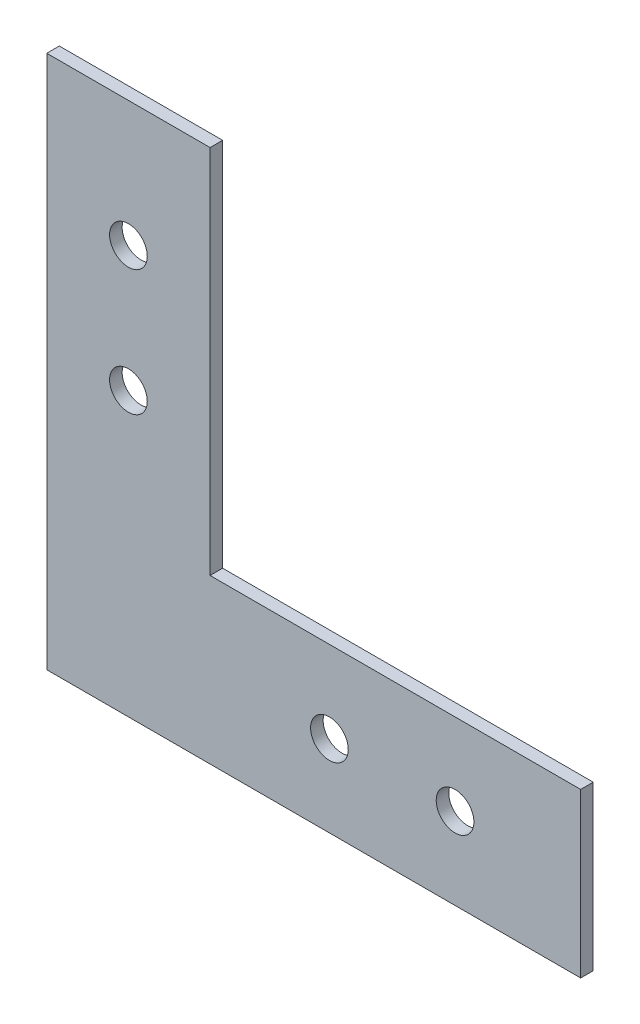
ISO-10303-21;
HEADER;
FILE_DESCRIPTION(('STEP AP214'),'2;1');
FILE_NAME('part.step','',(''),(''),'','','');
FILE_SCHEMA(('AUTOMOTIVE_DESIGN { 1 0 10303 214 1 1 1 1 }'));
ENDSEC;
DATA;
#1=APPLICATION_CONTEXT('core data for automotive mechanical design processes');
#2=APPLICATION_PROTOCOL_DEFINITION('international standard','automotive_design',2000,#1);
#3=PRODUCT_CONTEXT('',#1,'mechanical');
#4=PRODUCT('Part','Part','',(#3));
#5=PRODUCT_RELATED_PRODUCT_CATEGORY('part','',(#4));
#6=PRODUCT_DEFINITION_FORMATION('','',#4);
#7=PRODUCT_DEFINITION_CONTEXT('part definition',#1,'design');
#8=PRODUCT_DEFINITION('design','',#6,#7);
#9=PRODUCT_DEFINITION_SHAPE('','',#8);
#10=(LENGTH_UNIT() NAMED_UNIT(*) SI_UNIT(.MILLI.,.METRE.));
#11=(NAMED_UNIT(*) PLANE_ANGLE_UNIT() SI_UNIT($,.RADIAN.));
#12=(NAMED_UNIT(*) SI_UNIT($,.STERADIAN.) SOLID_ANGLE_UNIT());
#13=UNCERTAINTY_MEASURE_WITH_UNIT(LENGTH_MEASURE(1.E-05),#10,'distance_accuracy_value','');
#14=(GEOMETRIC_REPRESENTATION_CONTEXT(3) GLOBAL_UNCERTAINTY_ASSIGNED_CONTEXT((#13)) GLOBAL_UNIT_ASSIGNED_CONTEXT((#10,
#11,#12)) REPRESENTATION_CONTEXT('',''));
#15=CARTESIAN_POINT('',(0.,0.,0.));
#16=DIRECTION('',(0.,0.,1.));
#17=DIRECTION('',(1.,0.,0.));
#18=AXIS2_PLACEMENT_3D('',#15,#16,#17);
#19=CARTESIAN_POINT('',(13.,42.5,2.));
#20=DIRECTION('',(0.,0.,-1.));
#21=DIRECTION('',(-1.,0.,0.));
#22=AXIS2_PLACEMENT_3D('',#19,#20,#21);
#23=PLANE('',#22);
#24=CARTESIAN_POINT('',(52.,-29.4999999999999,2.));
#25=DIRECTION('',(0.,0.,-1.));
#26=DIRECTION('',(0.,1.,0.));
#27=AXIS2_PLACEMENT_3D('',#24,#25,#26);
#28=CIRCLE('',#27,3.);
#29=CARTESIAN_POINT('',(52.,-26.4999999999999,2.));
#30=VERTEX_POINT('',#29);
#31=EDGE_CURVE('E149',#30,#30,#28,.T.);
#32=ORIENTED_EDGE('',*,*,#31,.T.);
#33=EDGE_LOOP('',(#32));
#34=FACE_BOUND('',#33,.T.);
#35=CARTESIAN_POINT('',(0.,2.49999999999998,2.));
#36=DIRECTION('',(0.,0.,1.));
#37=DIRECTION('',(1.,0.,0.));
#38=AXIS2_PLACEMENT_3D('',#35,#36,#37);
#39=CIRCLE('',#38,3.);
#40=CARTESIAN_POINT('',(3.,2.49999999999998,2.));
#41=VERTEX_POINT('',#40);
#42=EDGE_CURVE('E146',#41,#41,#39,.T.);
#43=ORIENTED_EDGE('',*,*,#42,.F.);
#44=EDGE_LOOP('',(#43));
#45=FACE_BOUND('',#44,.T.);
#46=CARTESIAN_POINT('',(0.,22.5,2.));
#47=DIRECTION('',(0.,0.,1.));
#48=DIRECTION('',(1.,0.,0.));
#49=AXIS2_PLACEMENT_3D('',#46,#47,#48);
#50=CIRCLE('',#49,3.);
#51=CARTESIAN_POINT('',(3.,22.5,2.));
#52=VERTEX_POINT('',#51);
#53=EDGE_CURVE('E143',#52,#52,#50,.T.);
#54=ORIENTED_EDGE('',*,*,#53,.F.);
#55=EDGE_LOOP('',(#54));
#56=FACE_BOUND('',#55,.T.);
#57=DIRECTION('',(0.,-1.,0.));
#58=VECTOR('',#57,1.);
#59=CARTESIAN_POINT('',(-13.,-42.5,2.));
#60=LINE('',#59,#58);
#61=CARTESIAN_POINT('',(-13.,42.5,2.));
#62=VERTEX_POINT('',#61);
#63=CARTESIAN_POINT('',(-13.,-42.5,2.));
#64=VERTEX_POINT('',#63);
#65=EDGE_CURVE('E59',#62,#64,#60,.T.);
#66=ORIENTED_EDGE('',*,*,#65,.T.);
#67=DIRECTION('',(1.,0.,0.));
#68=VECTOR('',#67,1.);
#69=CARTESIAN_POINT('',(-13.,-42.5,2.));
#70=LINE('',#69,#68);
#71=CARTESIAN_POINT('',(72.,-42.4999999999997,2.));
#72=VERTEX_POINT('',#71);
#73=EDGE_CURVE('E95',#64,#72,#70,.T.);
#74=ORIENTED_EDGE('',*,*,#73,.T.);
#75=DIRECTION('',(0.,-1.,0.));
#76=VECTOR('',#75,1.);
#77=CARTESIAN_POINT('',(72.,-42.4999999999997,2.));
#78=LINE('',#77,#76);
#79=CARTESIAN_POINT('',(71.9999999999999,-16.4999999999998,2.));
#80=VERTEX_POINT('',#79);
#81=EDGE_CURVE('E99',#80,#72,#78,.T.);
#82=ORIENTED_EDGE('',*,*,#81,.F.);
#83=DIRECTION('',(1.,0.,0.));
#84=VECTOR('',#83,1.);
#85=CARTESIAN_POINT('',(-13.0000000000001,-16.5,2.));
#86=LINE('',#85,#84);
#87=CARTESIAN_POINT('',(13.,-16.5,2.));
#88=VERTEX_POINT('',#87);
#89=EDGE_CURVE('E117',#88,#80,#86,.T.);
#90=ORIENTED_EDGE('',*,*,#89,.F.);
#91=DIRECTION('',(0.,1.,0.));
#92=VECTOR('',#91,1.);
#93=CARTESIAN_POINT('',(13.,-42.5,2.));
#94=LINE('',#93,#92);
#95=CARTESIAN_POINT('',(13.,42.5,2.));
#96=VERTEX_POINT('',#95);
#97=EDGE_CURVE('E50',#88,#96,#94,.T.);
#98=ORIENTED_EDGE('',*,*,#97,.T.);
#99=DIRECTION('',(-1.,0.,0.));
#100=VECTOR('',#99,1.);
#101=CARTESIAN_POINT('',(-13.,42.5,2.));
#102=LINE('',#101,#100);
#103=EDGE_CURVE('E131',#96,#62,#102,.T.);
#104=ORIENTED_EDGE('',*,*,#103,.T.);
#105=EDGE_LOOP('',(#66,#74,#82,#90,#98,#104));
#106=FACE_BOUND('',#105,.T.);
#107=CARTESIAN_POINT('',(32.,-29.5,2.));
#108=DIRECTION('',(0.,0.,-1.));
#109=DIRECTION('',(0.,1.,0.));
#110=AXIS2_PLACEMENT_3D('',#107,#108,#109);
#111=CIRCLE('',#110,3.);
#112=CARTESIAN_POINT('',(32.,-26.5,2.));
#113=VERTEX_POINT('',#112);
#114=EDGE_CURVE('E159',#113,#113,#111,.T.);
#115=ORIENTED_EDGE('',*,*,#114,.T.);
#116=EDGE_LOOP('',(#115));
#117=FACE_BOUND('',#116,.T.);
#118=ADVANCED_FACE('F33',(#34,#45,#56,#106,#117),#23,.F.);
#119=CARTESIAN_POINT('',(13.,42.5,0.));
#120=DIRECTION('',(0.,0.,-1.));
#121=DIRECTION('',(-1.,0.,0.));
#122=AXIS2_PLACEMENT_3D('',#119,#120,#121);
#123=PLANE('',#122);
#124=CARTESIAN_POINT('',(52.,-29.4999999999999,0.));
#125=DIRECTION('',(0.,0.,-1.));
#126=DIRECTION('',(-1.,0.,0.));
#127=AXIS2_PLACEMENT_3D('',#124,#125,#126);
#128=CIRCLE('',#127,3.);
#129=CARTESIAN_POINT('',(49.,-29.4999999999999,0.));
#130=VERTEX_POINT('',#129);
#131=EDGE_CURVE('E147',#130,#130,#128,.F.);
#132=ORIENTED_EDGE('',*,*,#131,.T.);
#133=EDGE_LOOP('',(#132));
#134=FACE_BOUND('',#133,.T.);
#135=CARTESIAN_POINT('',(0.,2.49999999999998,0.));
#136=DIRECTION('',(0.,0.,-1.));
#137=DIRECTION('',(-1.,0.,0.));
#138=AXIS2_PLACEMENT_3D('',#135,#136,#137);
#139=CIRCLE('',#138,3.);
#140=CARTESIAN_POINT('',(-3.,2.49999999999998,0.));
#141=VERTEX_POINT('',#140);
#142=EDGE_CURVE('E144',#141,#141,#139,.T.);
#143=ORIENTED_EDGE('',*,*,#142,.F.);
#144=EDGE_LOOP('',(#143));
#145=FACE_BOUND('',#144,.T.);
#146=CARTESIAN_POINT('',(0.,22.5,0.));
#147=DIRECTION('',(0.,0.,-1.));
#148=DIRECTION('',(-1.,0.,0.));
#149=AXIS2_PLACEMENT_3D('',#146,#147,#148);
#150=CIRCLE('',#149,3.);
#151=CARTESIAN_POINT('',(-3.,22.5,0.));
#152=VERTEX_POINT('',#151);
#153=EDGE_CURVE('E126',#152,#152,#150,.T.);
#154=ORIENTED_EDGE('',*,*,#153,.F.);
#155=EDGE_LOOP('',(#154));
#156=FACE_BOUND('',#155,.T.);
#157=DIRECTION('',(0.,1.,0.));
#158=VECTOR('',#157,1.);
#159=CARTESIAN_POINT('',(13.,-42.5,0.));
#160=LINE('',#159,#158);
#161=CARTESIAN_POINT('',(13.,-16.5,0.));
#162=VERTEX_POINT('',#161);
#163=CARTESIAN_POINT('',(13.,42.5,0.));
#164=VERTEX_POINT('',#163);
#165=EDGE_CURVE('E129',#162,#164,#160,.T.);
#166=ORIENTED_EDGE('',*,*,#165,.F.);
#167=DIRECTION('',(1.,0.,0.));
#168=VECTOR('',#167,1.);
#169=CARTESIAN_POINT('',(-13.0000000000001,-16.5,0.));
#170=LINE('',#169,#168);
#171=CARTESIAN_POINT('',(71.9999999999999,-16.4999999999998,0.));
#172=VERTEX_POINT('',#171);
#173=EDGE_CURVE('E124',#162,#172,#170,.T.);
#174=ORIENTED_EDGE('',*,*,#173,.T.);
#175=DIRECTION('',(0.,-1.,0.));
#176=VECTOR('',#175,1.);
#177=CARTESIAN_POINT('',(72.,-42.4999999999997,0.));
#178=LINE('',#177,#176);
#179=CARTESIAN_POINT('',(72.,-42.4999999999997,0.));
#180=VERTEX_POINT('',#179);
#181=EDGE_CURVE('E120',#172,#180,#178,.T.);
#182=ORIENTED_EDGE('',*,*,#181,.T.);
#183=DIRECTION('',(1.,0.,0.));
#184=VECTOR('',#183,1.);
#185=CARTESIAN_POINT('',(-13.,-42.5,0.));
#186=LINE('',#185,#184);
#187=CARTESIAN_POINT('',(-13.,-42.5,0.));
#188=VERTEX_POINT('',#187);
#189=EDGE_CURVE('E107',#188,#180,#186,.T.);
#190=ORIENTED_EDGE('',*,*,#189,.F.);
#191=DIRECTION('',(0.,-1.,0.));
#192=VECTOR('',#191,1.);
#193=CARTESIAN_POINT('',(-13.,-42.5,0.));
#194=LINE('',#193,#192);
#195=CARTESIAN_POINT('',(-13.,42.5,0.));
#196=VERTEX_POINT('',#195);
#197=EDGE_CURVE('E76',#196,#188,#194,.T.);
#198=ORIENTED_EDGE('',*,*,#197,.F.);
#199=DIRECTION('',(-1.,0.,0.));
#200=VECTOR('',#199,1.);
#201=CARTESIAN_POINT('',(-13.,42.5,0.));
#202=LINE('',#201,#200);
#203=EDGE_CURVE('E135',#164,#196,#202,.T.);
#204=ORIENTED_EDGE('',*,*,#203,.F.);
#205=EDGE_LOOP('',(#166,#174,#182,#190,#198,#204));
#206=FACE_BOUND('',#205,.T.);
#207=CARTESIAN_POINT('',(32.,-29.5,0.));
#208=DIRECTION('',(0.,0.,-1.));
#209=DIRECTION('',(-1.,0.,0.));
#210=AXIS2_PLACEMENT_3D('',#207,#208,#209);
#211=CIRCLE('',#210,3.);
#212=CARTESIAN_POINT('',(29.,-29.5,0.));
#213=VERTEX_POINT('',#212);
#214=EDGE_CURVE('E37',#213,#213,#211,.F.);
#215=ORIENTED_EDGE('',*,*,#214,.T.);
#216=EDGE_LOOP('',(#215));
#217=FACE_BOUND('',#216,.T.);
#218=ADVANCED_FACE('F167',(#134,#145,#156,#206,#217),#123,.T.);
#219=CARTESIAN_POINT('',(13.,-42.5,2.));
#220=DIRECTION('',(-1.,0.,0.));
#221=DIRECTION('',(0.,0.,1.));
#222=AXIS2_PLACEMENT_3D('',#219,#220,#221);
#223=PLANE('',#222);
#224=ORIENTED_EDGE('',*,*,#97,.F.);
#225=DIRECTION('',(0.,0.,-1.));
#226=VECTOR('',#225,1.);
#227=CARTESIAN_POINT('',(13.,-16.5,2.));
#228=LINE('',#227,#226);
#229=EDGE_CURVE('E111',#88,#162,#228,.T.);
#230=ORIENTED_EDGE('',*,*,#229,.T.);
#231=ORIENTED_EDGE('',*,*,#165,.T.);
#232=DIRECTION('',(0.,0.,-1.));
#233=VECTOR('',#232,1.);
#234=CARTESIAN_POINT('',(13.,42.5,2.));
#235=LINE('',#234,#233);
#236=EDGE_CURVE('E11',#96,#164,#235,.T.);
#237=ORIENTED_EDGE('',*,*,#236,.F.);
#238=EDGE_LOOP('',(#224,#230,#231,#237));
#239=FACE_BOUND('',#238,.T.);
#240=ADVANCED_FACE('F35',(#239),#223,.F.);
#241=CARTESIAN_POINT('',(-13.,42.5,2.));
#242=DIRECTION('',(0.,-1.,0.));
#243=DIRECTION('',(0.,0.,-1.));
#244=AXIS2_PLACEMENT_3D('',#241,#242,#243);
#245=PLANE('',#244);
#246=ORIENTED_EDGE('',*,*,#203,.T.);
#247=DIRECTION('',(0.,0.,-1.));
#248=VECTOR('',#247,1.);
#249=CARTESIAN_POINT('',(-13.,42.5,2.));
#250=LINE('',#249,#248);
#251=EDGE_CURVE('E42',#62,#196,#250,.T.);
#252=ORIENTED_EDGE('',*,*,#251,.F.);
#253=ORIENTED_EDGE('',*,*,#103,.F.);
#254=ORIENTED_EDGE('',*,*,#236,.T.);
#255=EDGE_LOOP('',(#246,#252,#253,#254));
#256=FACE_BOUND('',#255,.T.);
#257=ADVANCED_FACE('F182',(#256),#245,.F.);
#258=CARTESIAN_POINT('',(-13.,-42.5,2.));
#259=DIRECTION('',(1.,0.,0.));
#260=DIRECTION('',(0.,0.,-1.));
#261=AXIS2_PLACEMENT_3D('',#258,#259,#260);
#262=PLANE('',#261);
#263=ORIENTED_EDGE('',*,*,#197,.T.);
#264=DIRECTION('',(0.,0.,-1.));
#265=VECTOR('',#264,1.);
#266=CARTESIAN_POINT('',(-13.,-42.5,2.));
#267=LINE('',#266,#265);
#268=EDGE_CURVE('E101',#64,#188,#267,.T.);
#269=ORIENTED_EDGE('',*,*,#268,.F.);
#270=ORIENTED_EDGE('',*,*,#65,.F.);
#271=ORIENTED_EDGE('',*,*,#251,.T.);
#272=EDGE_LOOP('',(#263,#269,#270,#271));
#273=FACE_BOUND('',#272,.T.);
#274=ADVANCED_FACE('F180',(#273),#262,.F.);
#275=CARTESIAN_POINT('',(-13.,-42.5,2.));
#276=DIRECTION('',(0.,1.,0.));
#277=DIRECTION('',(0.,0.,1.));
#278=AXIS2_PLACEMENT_3D('',#275,#276,#277);
#279=PLANE('',#278);
#280=ORIENTED_EDGE('',*,*,#189,.T.);
#281=DIRECTION('',(0.,0.,-1.));
#282=VECTOR('',#281,1.);
#283=CARTESIAN_POINT('',(72.,-42.4999999999997,2.));
#284=LINE('',#283,#282);
#285=EDGE_CURVE('E104',#72,#180,#284,.T.);
#286=ORIENTED_EDGE('',*,*,#285,.F.);
#287=ORIENTED_EDGE('',*,*,#73,.F.);
#288=ORIENTED_EDGE('',*,*,#268,.T.);
#289=EDGE_LOOP('',(#280,#286,#287,#288));
#290=FACE_BOUND('',#289,.T.);
#291=ADVANCED_FACE('F105',(#290),#279,.F.);
#292=CARTESIAN_POINT('',(-13.0000000000001,-16.5,2.));
#293=DIRECTION('',(0.,1.,0.));
#294=DIRECTION('',(-1.,0.,0.));
#295=AXIS2_PLACEMENT_3D('',#292,#293,#294);
#296=PLANE('',#295);
#297=ORIENTED_EDGE('',*,*,#229,.F.);
#298=ORIENTED_EDGE('',*,*,#89,.T.);
#299=DIRECTION('',(0.,0.,-1.));
#300=VECTOR('',#299,1.);
#301=CARTESIAN_POINT('',(71.9999999999999,-16.4999999999998,2.));
#302=LINE('',#301,#300);
#303=EDGE_CURVE('E112',#80,#172,#302,.T.);
#304=ORIENTED_EDGE('',*,*,#303,.T.);
#305=ORIENTED_EDGE('',*,*,#173,.F.);
#306=EDGE_LOOP('',(#297,#298,#304,#305));
#307=FACE_BOUND('',#306,.T.);
#308=ADVANCED_FACE('F175',(#307),#296,.T.);
#309=CARTESIAN_POINT('',(72.,-42.4999999999997,2.));
#310=DIRECTION('',(1.,0.,0.));
#311=DIRECTION('',(0.,1.,0.));
#312=AXIS2_PLACEMENT_3D('',#309,#310,#311);
#313=PLANE('',#312);
#314=ORIENTED_EDGE('',*,*,#181,.F.);
#315=ORIENTED_EDGE('',*,*,#303,.F.);
#316=ORIENTED_EDGE('',*,*,#81,.T.);
#317=ORIENTED_EDGE('',*,*,#285,.T.);
#318=EDGE_LOOP('',(#314,#315,#316,#317));
#319=FACE_BOUND('',#318,.T.);
#320=ADVANCED_FACE('F115',(#319),#313,.T.);
#321=CARTESIAN_POINT('',(0.,22.5,-8.));
#322=DIRECTION('',(0.,0.,1.));
#323=DIRECTION('',(1.,0.,0.));
#324=AXIS2_PLACEMENT_3D('',#321,#322,#323);
#325=CYLINDRICAL_SURFACE('',#324,3.);
#326=ORIENTED_EDGE('',*,*,#153,.T.);
#327=EDGE_LOOP('',(#326));
#328=FACE_BOUND('',#327,.T.);
#329=ORIENTED_EDGE('',*,*,#53,.T.);
#330=EDGE_LOOP('',(#329));
#331=FACE_BOUND('',#330,.T.);
#332=ADVANCED_FACE('F164',(#328,#331),#325,.F.);
#333=CARTESIAN_POINT('',(0.,2.49999999999998,-8.));
#334=DIRECTION('',(0.,0.,1.));
#335=DIRECTION('',(1.,0.,0.));
#336=AXIS2_PLACEMENT_3D('',#333,#334,#335);
#337=CYLINDRICAL_SURFACE('',#336,3.);
#338=ORIENTED_EDGE('',*,*,#142,.T.);
#339=EDGE_LOOP('',(#338));
#340=FACE_BOUND('',#339,.T.);
#341=ORIENTED_EDGE('',*,*,#42,.T.);
#342=EDGE_LOOP('',(#341));
#343=FACE_BOUND('',#342,.T.);
#344=ADVANCED_FACE('F201',(#340,#343),#337,.F.);
#345=CARTESIAN_POINT('',(52.,-29.4999999999999,-8.));
#346=DIRECTION('',(0.,0.,1.));
#347=DIRECTION('',(1.,0.,0.));
#348=AXIS2_PLACEMENT_3D('',#345,#346,#347);
#349=CYLINDRICAL_SURFACE('',#348,3.);
#350=ORIENTED_EDGE('',*,*,#131,.F.);
#351=EDGE_LOOP('',(#350));
#352=FACE_BOUND('',#351,.T.);
#353=ORIENTED_EDGE('',*,*,#31,.F.);
#354=EDGE_LOOP('',(#353));
#355=FACE_BOUND('',#354,.T.);
#356=ADVANCED_FACE('F207',(#352,#355),#349,.F.);
#357=CARTESIAN_POINT('',(32.,-29.5,-8.));
#358=DIRECTION('',(0.,0.,1.));
#359=DIRECTION('',(1.,0.,0.));
#360=AXIS2_PLACEMENT_3D('',#357,#358,#359);
#361=CYLINDRICAL_SURFACE('',#360,3.);
#362=ORIENTED_EDGE('',*,*,#214,.F.);
#363=EDGE_LOOP('',(#362));
#364=FACE_BOUND('',#363,.T.);
#365=ORIENTED_EDGE('',*,*,#114,.F.);
#366=EDGE_LOOP('',(#365));
#367=FACE_BOUND('',#366,.T.);
#368=ADVANCED_FACE('F211',(#364,#367),#361,.F.);
#369=CLOSED_SHELL('',(#118,#218,#240,#257,#274,#291,#308,#320,#332,#344,#356,#368));
#370=MANIFOLD_SOLID_BREP('B2',#369);
#371=ADVANCED_BREP_SHAPE_REPRESENTATION('',(#18,#370),#14);
#372=SHAPE_DEFINITION_REPRESENTATION(#9,#371);
ENDSEC;
END-ISO-10303-21;
